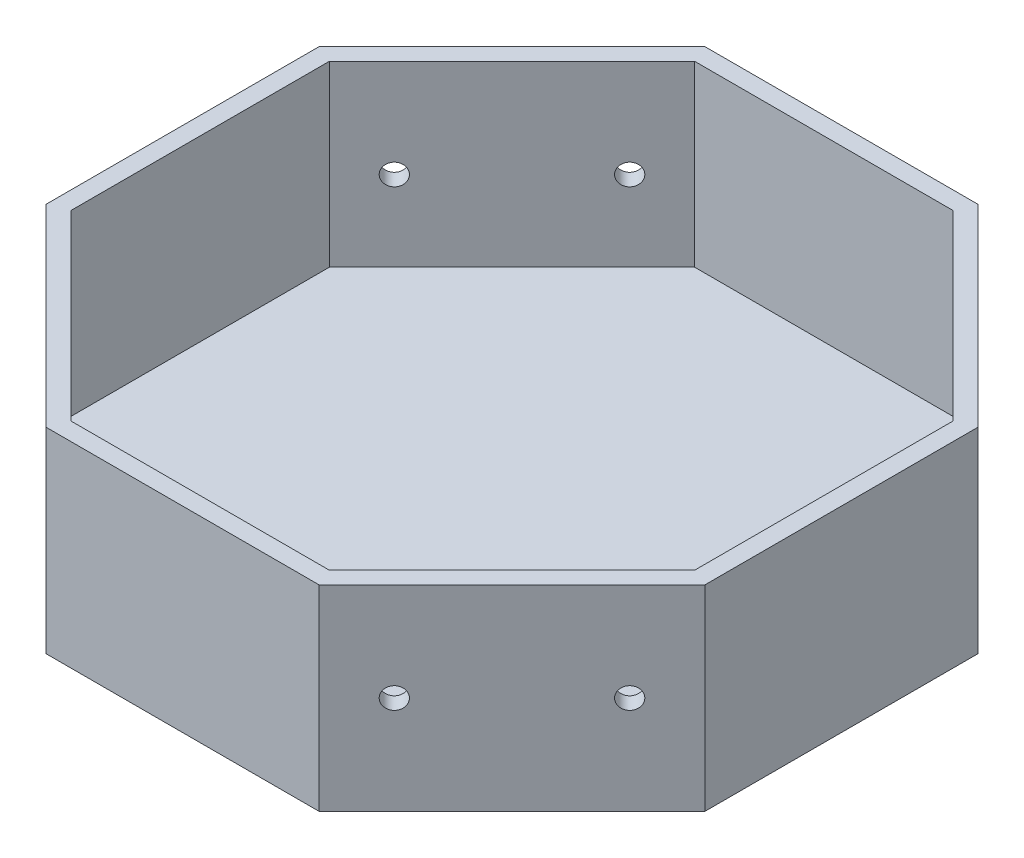
ISO-10303-21;
HEADER;
FILE_DESCRIPTION(('STEP AP214'),'2;1');
FILE_NAME('part.step','',(''),(''),'','','');
FILE_SCHEMA(('AUTOMOTIVE_DESIGN { 1 0 10303 214 1 1 1 1 }'));
ENDSEC;
DATA;
#1=APPLICATION_CONTEXT('core data for automotive mechanical design processes');
#2=APPLICATION_PROTOCOL_DEFINITION('international standard','automotive_design',2000,#1);
#3=PRODUCT_CONTEXT('',#1,'mechanical');
#4=PRODUCT('Part','Part','',(#3));
#5=PRODUCT_RELATED_PRODUCT_CATEGORY('part','',(#4));
#6=PRODUCT_DEFINITION_FORMATION('','',#4);
#7=PRODUCT_DEFINITION_CONTEXT('part definition',#1,'design');
#8=PRODUCT_DEFINITION('design','',#6,#7);
#9=PRODUCT_DEFINITION_SHAPE('','',#8);
#10=(LENGTH_UNIT() NAMED_UNIT(*) SI_UNIT(.MILLI.,.METRE.));
#11=(NAMED_UNIT(*) PLANE_ANGLE_UNIT() SI_UNIT($,.RADIAN.));
#12=(NAMED_UNIT(*) SI_UNIT($,.STERADIAN.) SOLID_ANGLE_UNIT());
#13=UNCERTAINTY_MEASURE_WITH_UNIT(LENGTH_MEASURE(1.E-05),#10,'distance_accuracy_value','');
#14=(GEOMETRIC_REPRESENTATION_CONTEXT(3) GLOBAL_UNCERTAINTY_ASSIGNED_CONTEXT((#13)) GLOBAL_UNIT_ASSIGNED_CONTEXT((#10,
#11,#12)) REPRESENTATION_CONTEXT('',''));
#15=CARTESIAN_POINT('',(0.,0.,0.));
#16=DIRECTION('',(0.,0.,1.));
#17=DIRECTION('',(1.,0.,0.));
#18=AXIS2_PLACEMENT_3D('',#15,#16,#17);
#19=CARTESIAN_POINT('',(55.4327719506772,3.,22.9610059419054));
#20=DIRECTION('',(-1.,0.,0.));
#21=DIRECTION('',(0.,0.,1.));
#22=AXIS2_PLACEMENT_3D('',#19,#20,#21);
#23=PLANE('',#22);
#24=DIRECTION('',(0.,0.,-1.));
#25=VECTOR('',#24,1.);
#26=CARTESIAN_POINT('',(55.4327719506772,0.,22.9610059419054));
#27=LINE('',#26,#25);
#28=CARTESIAN_POINT('',(55.4327719506772,0.,22.9610059419054));
#29=VERTEX_POINT('',#28);
#30=CARTESIAN_POINT('',(55.4327719506772,0.,-22.9610059419054));
#31=VERTEX_POINT('',#30);
#32=EDGE_CURVE('E245',#29,#31,#27,.T.);
#33=ORIENTED_EDGE('',*,*,#32,.T.);
#34=DIRECTION('',(0.,-1.,0.));
#35=VECTOR('',#34,1.);
#36=CARTESIAN_POINT('',(55.4327719506772,3.,-22.9610059419054));
#37=LINE('',#36,#35);
#38=CARTESIAN_POINT('',(55.4327719506772,33.,-22.9610059419054));
#39=VERTEX_POINT('',#38);
#40=EDGE_CURVE('E11',#39,#31,#37,.T.);
#41=ORIENTED_EDGE('',*,*,#40,.F.);
#42=DIRECTION('',(0.,0.,-1.));
#43=VECTOR('',#42,1.);
#44=CARTESIAN_POINT('',(55.4327719506772,33.,22.9610059419054));
#45=LINE('',#44,#43);
#46=CARTESIAN_POINT('',(55.4327719506772,33.,22.9610059419054));
#47=VERTEX_POINT('',#46);
#48=EDGE_CURVE('E224',#47,#39,#45,.T.);
#49=ORIENTED_EDGE('',*,*,#48,.F.);
#50=DIRECTION('',(0.,-1.,0.));
#51=VECTOR('',#50,1.);
#52=CARTESIAN_POINT('',(55.4327719506772,3.,22.9610059419054));
#53=LINE('',#52,#51);
#54=EDGE_CURVE('E262',#47,#29,#53,.T.);
#55=ORIENTED_EDGE('',*,*,#54,.T.);
#56=EDGE_LOOP('',(#33,#41,#49,#55));
#57=FACE_BOUND('',#56,.T.);
#58=ADVANCED_FACE('F43',(#57),#23,.F.);
#59=CARTESIAN_POINT('',(55.4327719506772,3.,-22.9610059419054));
#60=DIRECTION('',(-0.707106781186547,0.,0.707106781186547));
#61=DIRECTION('',(0.707106781186548,0.,0.707106781186548));
#62=AXIS2_PLACEMENT_3D('',#59,#60,#61);
#63=PLANE('',#62);
#64=CARTESIAN_POINT('',(49.0963838829029,16.5,-29.2973940096798));
#65=DIRECTION('',(0.707106781186545,0.,-0.70710678118655));
#66=DIRECTION('',(-0.70710678118655,0.,-0.707106781186545));
#67=AXIS2_PLACEMENT_3D('',#64,#65,#66);
#68=CIRCLE('',#67,1.8);
#69=CARTESIAN_POINT('',(47.8235916767671,16.5,-30.5701862158156));
#70=VERTEX_POINT('',#69);
#71=EDGE_CURVE('E410',#70,#70,#68,.T.);
#72=ORIENTED_EDGE('',*,*,#71,.F.);
#73=EDGE_LOOP('',(#72));
#74=FACE_BOUND('',#73,.T.);
#75=CARTESIAN_POINT('',(29.2973940096795,16.5,-49.0963838829031));
#76=DIRECTION('',(0.707106781186545,0.,-0.70710678118655));
#77=DIRECTION('',(-0.70710678118655,0.,-0.707106781186545));
#78=AXIS2_PLACEMENT_3D('',#75,#76,#77);
#79=CIRCLE('',#78,1.8);
#80=CARTESIAN_POINT('',(28.0246018035437,16.5,-50.3691760890389));
#81=VERTEX_POINT('',#80);
#82=EDGE_CURVE('E416',#81,#81,#79,.T.);
#83=ORIENTED_EDGE('',*,*,#82,.F.);
#84=EDGE_LOOP('',(#83));
#85=FACE_BOUND('',#84,.T.);
#86=DIRECTION('',(-0.707106781186548,0.,-0.707106781186548));
#87=VECTOR('',#86,1.);
#88=CARTESIAN_POINT('',(55.4327719506772,0.,-22.9610059419054));
#89=LINE('',#88,#87);
#90=CARTESIAN_POINT('',(22.9610059419054,0.,-55.4327719506772));
#91=VERTEX_POINT('',#90);
#92=EDGE_CURVE('E248',#31,#91,#89,.T.);
#93=ORIENTED_EDGE('',*,*,#92,.T.);
#94=DIRECTION('',(0.,-1.,0.));
#95=VECTOR('',#94,1.);
#96=CARTESIAN_POINT('',(22.9610059419054,3.,-55.4327719506772));
#97=LINE('',#96,#95);
#98=CARTESIAN_POINT('',(22.9610059419054,33.,-55.4327719506772));
#99=VERTEX_POINT('',#98);
#100=EDGE_CURVE('E50',#99,#91,#97,.T.);
#101=ORIENTED_EDGE('',*,*,#100,.F.);
#102=DIRECTION('',(-0.707106781186548,0.,-0.707106781186548));
#103=VECTOR('',#102,1.);
#104=CARTESIAN_POINT('',(55.4327719506772,33.,-22.9610059419054));
#105=LINE('',#104,#103);
#106=EDGE_CURVE('E227',#39,#99,#105,.T.);
#107=ORIENTED_EDGE('',*,*,#106,.F.);
#108=ORIENTED_EDGE('',*,*,#40,.T.);
#109=EDGE_LOOP('',(#93,#101,#107,#108));
#110=FACE_BOUND('',#109,.T.);
#111=ADVANCED_FACE('F312',(#74,#85,#110),#63,.F.);
#112=CARTESIAN_POINT('',(22.9610059419054,3.,-55.4327719506772));
#113=DIRECTION('',(0.,0.,1.));
#114=DIRECTION('',(1.,0.,0.));
#115=AXIS2_PLACEMENT_3D('',#112,#113,#114);
#116=PLANE('',#115);
#117=DIRECTION('',(-1.,0.,0.));
#118=VECTOR('',#117,1.);
#119=CARTESIAN_POINT('',(22.9610059419054,0.,-55.4327719506772));
#120=LINE('',#119,#118);
#121=CARTESIAN_POINT('',(-22.9610059419054,0.,-55.4327719506772));
#122=VERTEX_POINT('',#121);
#123=EDGE_CURVE('E250',#91,#122,#120,.T.);
#124=ORIENTED_EDGE('',*,*,#123,.T.);
#125=DIRECTION('',(0.,-1.,0.));
#126=VECTOR('',#125,1.);
#127=CARTESIAN_POINT('',(-22.9610059419054,3.,-55.4327719506772));
#128=LINE('',#127,#126);
#129=CARTESIAN_POINT('',(-22.9610059419054,33.,-55.4327719506772));
#130=VERTEX_POINT('',#129);
#131=EDGE_CURVE('E277',#130,#122,#128,.T.);
#132=ORIENTED_EDGE('',*,*,#131,.F.);
#133=DIRECTION('',(-1.,0.,0.));
#134=VECTOR('',#133,1.);
#135=CARTESIAN_POINT('',(22.9610059419054,33.,-55.4327719506772));
#136=LINE('',#135,#134);
#137=EDGE_CURVE('E230',#99,#130,#136,.T.);
#138=ORIENTED_EDGE('',*,*,#137,.F.);
#139=ORIENTED_EDGE('',*,*,#100,.T.);
#140=EDGE_LOOP('',(#124,#132,#138,#139));
#141=FACE_BOUND('',#140,.T.);
#142=ADVANCED_FACE('F283',(#141),#116,.F.);
#143=CARTESIAN_POINT('',(-22.9610059419054,3.,-55.4327719506772));
#144=DIRECTION('',(0.707106781186548,0.,0.707106781186547));
#145=DIRECTION('',(0.707106781186547,0.,-0.707106781186548));
#146=AXIS2_PLACEMENT_3D('',#143,#144,#145);
#147=PLANE('',#146);
#148=CARTESIAN_POINT('',(-29.2973940096796,16.5,-49.096383882903));
#149=DIRECTION('',(-0.707106781186548,0.,-0.707106781186547));
#150=DIRECTION('',(-0.707106781186547,0.,0.707106781186548));
#151=AXIS2_PLACEMENT_3D('',#148,#149,#150);
#152=CIRCLE('',#151,1.8);
#153=CARTESIAN_POINT('',(-30.5701862158154,16.5,-47.8235916767672));
#154=VERTEX_POINT('',#153);
#155=EDGE_CURVE('E422',#154,#154,#152,.T.);
#156=ORIENTED_EDGE('',*,*,#155,.F.);
#157=EDGE_LOOP('',(#156));
#158=FACE_BOUND('',#157,.T.);
#159=CARTESIAN_POINT('',(-49.096383882903,16.5,-29.2973940096796));
#160=DIRECTION('',(-0.707106781186548,0.,-0.707106781186547));
#161=DIRECTION('',(-0.707106781186547,0.,0.707106781186548));
#162=AXIS2_PLACEMENT_3D('',#159,#160,#161);
#163=CIRCLE('',#162,1.8);
#164=CARTESIAN_POINT('',(-50.3691760890388,16.5,-28.0246018035438));
#165=VERTEX_POINT('',#164);
#166=EDGE_CURVE('E430',#165,#165,#163,.T.);
#167=ORIENTED_EDGE('',*,*,#166,.F.);
#168=EDGE_LOOP('',(#167));
#169=FACE_BOUND('',#168,.T.);
#170=DIRECTION('',(-0.707106781186547,0.,0.707106781186548));
#171=VECTOR('',#170,1.);
#172=CARTESIAN_POINT('',(-22.9610059419054,0.,-55.4327719506772));
#173=LINE('',#172,#171);
#174=CARTESIAN_POINT('',(-55.4327719506772,0.,-22.9610059419054));
#175=VERTEX_POINT('',#174);
#176=EDGE_CURVE('E252',#122,#175,#173,.T.);
#177=ORIENTED_EDGE('',*,*,#176,.T.);
#178=DIRECTION('',(0.,-1.,0.));
#179=VECTOR('',#178,1.);
#180=CARTESIAN_POINT('',(-55.4327719506772,3.,-22.9610059419054));
#181=LINE('',#180,#179);
#182=CARTESIAN_POINT('',(-55.4327719506772,33.,-22.9610059419054));
#183=VERTEX_POINT('',#182);
#184=EDGE_CURVE('E274',#183,#175,#181,.T.);
#185=ORIENTED_EDGE('',*,*,#184,.F.);
#186=DIRECTION('',(-0.707106781186547,0.,0.707106781186548));
#187=VECTOR('',#186,1.);
#188=CARTESIAN_POINT('',(-22.9610059419054,33.,-55.4327719506772));
#189=LINE('',#188,#187);
#190=EDGE_CURVE('E233',#130,#183,#189,.T.);
#191=ORIENTED_EDGE('',*,*,#190,.F.);
#192=ORIENTED_EDGE('',*,*,#131,.T.);
#193=EDGE_LOOP('',(#177,#185,#191,#192));
#194=FACE_BOUND('',#193,.T.);
#195=ADVANCED_FACE('F293',(#158,#169,#194),#147,.F.);
#196=CARTESIAN_POINT('',(-55.4327719506772,3.,-22.9610059419054));
#197=DIRECTION('',(1.,0.,0.));
#198=DIRECTION('',(0.,0.,-1.));
#199=AXIS2_PLACEMENT_3D('',#196,#197,#198);
#200=PLANE('',#199);
#201=DIRECTION('',(0.,0.,1.));
#202=VECTOR('',#201,1.);
#203=CARTESIAN_POINT('',(-55.4327719506772,0.,-22.9610059419054));
#204=LINE('',#203,#202);
#205=CARTESIAN_POINT('',(-55.4327719506772,0.,22.9610059419054));
#206=VERTEX_POINT('',#205);
#207=EDGE_CURVE('E254',#175,#206,#204,.T.);
#208=ORIENTED_EDGE('',*,*,#207,.T.);
#209=DIRECTION('',(0.,-1.,0.));
#210=VECTOR('',#209,1.);
#211=CARTESIAN_POINT('',(-55.4327719506772,3.,22.9610059419054));
#212=LINE('',#211,#210);
#213=CARTESIAN_POINT('',(-55.4327719506772,33.,22.9610059419054));
#214=VERTEX_POINT('',#213);
#215=EDGE_CURVE('E271',#214,#206,#212,.T.);
#216=ORIENTED_EDGE('',*,*,#215,.F.);
#217=DIRECTION('',(0.,0.,1.));
#218=VECTOR('',#217,1.);
#219=CARTESIAN_POINT('',(-55.4327719506772,33.,-22.9610059419054));
#220=LINE('',#219,#218);
#221=EDGE_CURVE('E236',#183,#214,#220,.T.);
#222=ORIENTED_EDGE('',*,*,#221,.F.);
#223=ORIENTED_EDGE('',*,*,#184,.T.);
#224=EDGE_LOOP('',(#208,#216,#222,#223));
#225=FACE_BOUND('',#224,.T.);
#226=ADVANCED_FACE('F297',(#225),#200,.F.);
#227=CARTESIAN_POINT('',(-55.4327719506772,3.,22.9610059419054));
#228=DIRECTION('',(0.707106781186547,0.,-0.707106781186548));
#229=DIRECTION('',(-0.707106781186548,0.,-0.707106781186547));
#230=AXIS2_PLACEMENT_3D('',#227,#228,#229);
#231=PLANE('',#230);
#232=CARTESIAN_POINT('',(-49.0963838829027,16.5,29.2973940096802));
#233=DIRECTION('',(-0.70710678118654,0.,0.707106781186555));
#234=DIRECTION('',(0.707106781186555,0.,0.70710678118654));
#235=AXIS2_PLACEMENT_3D('',#232,#233,#234);
#236=CIRCLE('',#235,1.8);
#237=CARTESIAN_POINT('',(-47.8235916767669,16.5,30.5701862158159));
#238=VERTEX_POINT('',#237);
#239=EDGE_CURVE('E436',#238,#238,#236,.T.);
#240=ORIENTED_EDGE('',*,*,#239,.F.);
#241=EDGE_LOOP('',(#240));
#242=FACE_BOUND('',#241,.T.);
#243=CARTESIAN_POINT('',(-29.2973940096791,16.5,49.0963838829033));
#244=DIRECTION('',(-0.70710678118654,0.,0.707106781186555));
#245=DIRECTION('',(0.707106781186555,0.,0.70710678118654));
#246=AXIS2_PLACEMENT_3D('',#243,#244,#245);
#247=CIRCLE('',#246,1.8);
#248=CARTESIAN_POINT('',(-28.0246018035433,16.5,50.3691760890391));
#249=VERTEX_POINT('',#248);
#250=EDGE_CURVE('E442',#249,#249,#247,.T.);
#251=ORIENTED_EDGE('',*,*,#250,.F.);
#252=EDGE_LOOP('',(#251));
#253=FACE_BOUND('',#252,.T.);
#254=DIRECTION('',(0.707106781186548,0.,0.707106781186547));
#255=VECTOR('',#254,1.);
#256=CARTESIAN_POINT('',(-55.4327719506772,0.,22.9610059419054));
#257=LINE('',#256,#255);
#258=CARTESIAN_POINT('',(-22.9610059419053,0.,55.4327719506772));
#259=VERTEX_POINT('',#258);
#260=EDGE_CURVE('E256',#206,#259,#257,.T.);
#261=ORIENTED_EDGE('',*,*,#260,.T.);
#262=DIRECTION('',(0.,-1.,0.));
#263=VECTOR('',#262,1.);
#264=CARTESIAN_POINT('',(-22.9610059419053,3.,55.4327719506772));
#265=LINE('',#264,#263);
#266=CARTESIAN_POINT('',(-22.9610059419053,33.,55.4327719506772));
#267=VERTEX_POINT('',#266);
#268=EDGE_CURVE('E268',#267,#259,#265,.T.);
#269=ORIENTED_EDGE('',*,*,#268,.F.);
#270=DIRECTION('',(0.707106781186548,0.,0.707106781186547));
#271=VECTOR('',#270,1.);
#272=CARTESIAN_POINT('',(-55.4327719506772,33.,22.9610059419054));
#273=LINE('',#272,#271);
#274=EDGE_CURVE('E239',#214,#267,#273,.T.);
#275=ORIENTED_EDGE('',*,*,#274,.F.);
#276=ORIENTED_EDGE('',*,*,#215,.T.);
#277=EDGE_LOOP('',(#261,#269,#275,#276));
#278=FACE_BOUND('',#277,.T.);
#279=ADVANCED_FACE('F302',(#242,#253,#278),#231,.F.);
#280=CARTESIAN_POINT('',(-22.9610059419053,3.,55.4327719506772));
#281=DIRECTION('',(0.,0.,-1.));
#282=DIRECTION('',(-1.,0.,0.));
#283=AXIS2_PLACEMENT_3D('',#280,#281,#282);
#284=PLANE('',#283);
#285=DIRECTION('',(1.,0.,0.));
#286=VECTOR('',#285,1.);
#287=CARTESIAN_POINT('',(-22.9610059419053,0.,55.4327719506772));
#288=LINE('',#287,#286);
#289=CARTESIAN_POINT('',(22.9610059419054,0.,55.4327719506772));
#290=VERTEX_POINT('',#289);
#291=EDGE_CURVE('E258',#259,#290,#288,.T.);
#292=ORIENTED_EDGE('',*,*,#291,.T.);
#293=DIRECTION('',(0.,-1.,0.));
#294=VECTOR('',#293,1.);
#295=CARTESIAN_POINT('',(22.9610059419054,3.,55.4327719506772));
#296=LINE('',#295,#294);
#297=CARTESIAN_POINT('',(22.9610059419054,33.,55.4327719506772));
#298=VERTEX_POINT('',#297);
#299=EDGE_CURVE('E265',#298,#290,#296,.T.);
#300=ORIENTED_EDGE('',*,*,#299,.F.);
#301=DIRECTION('',(1.,0.,0.));
#302=VECTOR('',#301,1.);
#303=CARTESIAN_POINT('',(-22.9610059419053,33.,55.4327719506772));
#304=LINE('',#303,#302);
#305=EDGE_CURVE('E242',#267,#298,#304,.T.);
#306=ORIENTED_EDGE('',*,*,#305,.F.);
#307=ORIENTED_EDGE('',*,*,#268,.T.);
#308=EDGE_LOOP('',(#292,#300,#306,#307));
#309=FACE_BOUND('',#308,.T.);
#310=ADVANCED_FACE('F305',(#309),#284,.F.);
#311=CARTESIAN_POINT('',(22.9610059419054,3.,55.4327719506772));
#312=DIRECTION('',(-0.707106781186548,0.,-0.707106781186547));
#313=DIRECTION('',(-0.707106781186547,0.,0.707106781186548));
#314=AXIS2_PLACEMENT_3D('',#311,#312,#313);
#315=PLANE('',#314);
#316=CARTESIAN_POINT('',(29.2973940096796,16.5,49.096383882903));
#317=DIRECTION('',(0.707106781186548,0.,0.707106781186547));
#318=DIRECTION('',(0.707106781186547,0.,-0.707106781186548));
#319=AXIS2_PLACEMENT_3D('',#316,#317,#318);
#320=CIRCLE('',#319,1.8);
#321=CARTESIAN_POINT('',(30.5701862158154,16.5,47.8235916767672));
#322=VERTEX_POINT('',#321);
#323=EDGE_CURVE('E192',#322,#322,#320,.T.);
#324=ORIENTED_EDGE('',*,*,#323,.F.);
#325=EDGE_LOOP('',(#324));
#326=FACE_BOUND('',#325,.T.);
#327=CARTESIAN_POINT('',(49.096383882903,16.5,29.2973940096796));
#328=DIRECTION('',(0.707106781186548,0.,0.707106781186547));
#329=DIRECTION('',(0.707106781186547,0.,-0.707106781186548));
#330=AXIS2_PLACEMENT_3D('',#327,#328,#329);
#331=CIRCLE('',#330,1.8);
#332=CARTESIAN_POINT('',(50.3691760890388,16.5,28.0246018035438));
#333=VERTEX_POINT('',#332);
#334=EDGE_CURVE('E411',#333,#333,#331,.T.);
#335=ORIENTED_EDGE('',*,*,#334,.F.);
#336=EDGE_LOOP('',(#335));
#337=FACE_BOUND('',#336,.T.);
#338=DIRECTION('',(0.707106781186547,0.,-0.707106781186548));
#339=VECTOR('',#338,1.);
#340=CARTESIAN_POINT('',(22.9610059419054,0.,55.4327719506772));
#341=LINE('',#340,#339);
#342=EDGE_CURVE('E260',#290,#29,#341,.T.);
#343=ORIENTED_EDGE('',*,*,#342,.T.);
#344=ORIENTED_EDGE('',*,*,#54,.F.);
#345=DIRECTION('',(0.707106781186547,0.,-0.707106781186548));
#346=VECTOR('',#345,1.);
#347=CARTESIAN_POINT('',(22.9610059419054,33.,55.4327719506772));
#348=LINE('',#347,#346);
#349=EDGE_CURVE('E169',#298,#47,#348,.T.);
#350=ORIENTED_EDGE('',*,*,#349,.F.);
#351=ORIENTED_EDGE('',*,*,#299,.T.);
#352=EDGE_LOOP('',(#343,#344,#350,#351));
#353=FACE_BOUND('',#352,.T.);
#354=ADVANCED_FACE('F308',(#326,#337,#353),#315,.F.);
#355=CARTESIAN_POINT('',(0.,0.,0.));
#356=DIRECTION('',(0.,1.,0.));
#357=DIRECTION('',(0.,0.,1.));
#358=AXIS2_PLACEMENT_3D('',#355,#356,#357);
#359=PLANE('',#358);
#360=ORIENTED_EDGE('',*,*,#32,.F.);
#361=ORIENTED_EDGE('',*,*,#342,.F.);
#362=ORIENTED_EDGE('',*,*,#291,.F.);
#363=ORIENTED_EDGE('',*,*,#260,.F.);
#364=ORIENTED_EDGE('',*,*,#207,.F.);
#365=ORIENTED_EDGE('',*,*,#176,.F.);
#366=ORIENTED_EDGE('',*,*,#123,.F.);
#367=ORIENTED_EDGE('',*,*,#92,.F.);
#368=EDGE_LOOP('',(#360,#361,#362,#363,#364,#365,#366,#367));
#369=FACE_BOUND('',#368,.T.);
#370=ADVANCED_FACE('F289',(#369),#359,.F.);
#371=CARTESIAN_POINT('',(0.,33.,0.));
#372=DIRECTION('',(0.,1.,0.));
#373=DIRECTION('',(0.,0.,1.));
#374=AXIS2_PLACEMENT_3D('',#371,#372,#373);
#375=PLANE('',#374);
#376=ORIENTED_EDGE('',*,*,#349,.T.);
#377=ORIENTED_EDGE('',*,*,#48,.T.);
#378=ORIENTED_EDGE('',*,*,#106,.T.);
#379=ORIENTED_EDGE('',*,*,#137,.T.);
#380=ORIENTED_EDGE('',*,*,#190,.T.);
#381=ORIENTED_EDGE('',*,*,#221,.T.);
#382=ORIENTED_EDGE('',*,*,#274,.T.);
#383=ORIENTED_EDGE('',*,*,#305,.T.);
#384=EDGE_LOOP('',(#376,#377,#378,#379,#380,#381,#382,#383));
#385=FACE_BOUND('',#384,.T.);
#386=DIRECTION('',(0.,0.,-1.));
#387=VECTOR('',#386,1.);
#388=CARTESIAN_POINT('',(52.4327719506772,33.,21.7183652547861));
#389=LINE('',#388,#387);
#390=CARTESIAN_POINT('',(52.4327719506772,33.,21.7183652547861));
#391=VERTEX_POINT('',#390);
#392=CARTESIAN_POINT('',(52.4327719506772,33.,-21.7183652547861));
#393=VERTEX_POINT('',#392);
#394=EDGE_CURVE('E163',#391,#393,#389,.T.);
#395=ORIENTED_EDGE('',*,*,#394,.F.);
#396=DIRECTION('',(0.707106781186547,0.,-0.707106781186548));
#397=VECTOR('',#396,1.);
#398=CARTESIAN_POINT('',(21.7183652547861,33.,52.4327719506772));
#399=LINE('',#398,#397);
#400=CARTESIAN_POINT('',(21.7183652547861,33.,52.4327719506772));
#401=VERTEX_POINT('',#400);
#402=EDGE_CURVE('E154',#401,#391,#399,.T.);
#403=ORIENTED_EDGE('',*,*,#402,.F.);
#404=DIRECTION('',(1.,0.,0.));
#405=VECTOR('',#404,1.);
#406=CARTESIAN_POINT('',(-21.7183652547861,33.,52.4327719506772));
#407=LINE('',#406,#405);
#408=CARTESIAN_POINT('',(-21.7183652547861,33.,52.4327719506772));
#409=VERTEX_POINT('',#408);
#410=EDGE_CURVE('E189',#409,#401,#407,.T.);
#411=ORIENTED_EDGE('',*,*,#410,.F.);
#412=DIRECTION('',(0.707106781186548,0.,0.707106781186547));
#413=VECTOR('',#412,1.);
#414=CARTESIAN_POINT('',(-52.4327719506772,33.,21.7183652547861));
#415=LINE('',#414,#413);
#416=CARTESIAN_POINT('',(-52.4327719506772,33.,21.7183652547861));
#417=VERTEX_POINT('',#416);
#418=EDGE_CURVE('E186',#417,#409,#415,.T.);
#419=ORIENTED_EDGE('',*,*,#418,.F.);
#420=DIRECTION('',(0.,0.,1.));
#421=VECTOR('',#420,1.);
#422=CARTESIAN_POINT('',(-52.4327719506772,33.,-21.7183652547861));
#423=LINE('',#422,#421);
#424=CARTESIAN_POINT('',(-52.4327719506772,33.,-21.7183652547861));
#425=VERTEX_POINT('',#424);
#426=EDGE_CURVE('E184',#425,#417,#423,.T.);
#427=ORIENTED_EDGE('',*,*,#426,.F.);
#428=DIRECTION('',(-0.707106781186547,0.,0.707106781186548));
#429=VECTOR('',#428,1.);
#430=CARTESIAN_POINT('',(-21.7183652547861,33.,-52.4327719506772));
#431=LINE('',#430,#429);
#432=CARTESIAN_POINT('',(-21.7183652547861,33.,-52.4327719506772));
#433=VERTEX_POINT('',#432);
#434=EDGE_CURVE('E182',#433,#425,#431,.T.);
#435=ORIENTED_EDGE('',*,*,#434,.F.);
#436=DIRECTION('',(-1.,0.,0.));
#437=VECTOR('',#436,1.);
#438=CARTESIAN_POINT('',(21.7183652547861,33.,-52.4327719506772));
#439=LINE('',#438,#437);
#440=CARTESIAN_POINT('',(21.7183652547861,33.,-52.4327719506772));
#441=VERTEX_POINT('',#440);
#442=EDGE_CURVE('E177',#441,#433,#439,.T.);
#443=ORIENTED_EDGE('',*,*,#442,.F.);
#444=DIRECTION('',(-0.707106781186548,0.,-0.707106781186548));
#445=VECTOR('',#444,1.);
#446=CARTESIAN_POINT('',(52.4327719506772,33.,-21.7183652547861));
#447=LINE('',#446,#445);
#448=EDGE_CURVE('E175',#393,#441,#447,.T.);
#449=ORIENTED_EDGE('',*,*,#448,.F.);
#450=EDGE_LOOP('',(#395,#403,#411,#419,#427,#435,#443,#449));
#451=FACE_BOUND('',#450,.T.);
#452=ADVANCED_FACE('F173',(#385,#451),#375,.T.);
#453=CARTESIAN_POINT('',(21.7183652547861,33.,52.4327719506772));
#454=DIRECTION('',(-0.707106781186548,0.,-0.707106781186547));
#455=DIRECTION('',(-0.707106781186547,0.,0.707106781186548));
#456=AXIS2_PLACEMENT_3D('',#453,#454,#455);
#457=PLANE('',#456);
#458=CARTESIAN_POINT('',(27.17607366612,16.5,46.9750635393433));
#459=DIRECTION('',(-0.707106781186548,0.,-0.707106781186547));
#460=DIRECTION('',(-0.707106781186547,0.,0.707106781186548));
#461=AXIS2_PLACEMENT_3D('',#458,#459,#460);
#462=CIRCLE('',#461,1.8);
#463=CARTESIAN_POINT('',(25.9032814599842,16.5,48.2478557454791));
#464=VERTEX_POINT('',#463);
#465=EDGE_CURVE('E448',#464,#464,#462,.F.);
#466=ORIENTED_EDGE('',*,*,#465,.T.);
#467=EDGE_LOOP('',(#466));
#468=FACE_BOUND('',#467,.T.);
#469=CARTESIAN_POINT('',(46.9750635393433,16.5,27.17607366612));
#470=DIRECTION('',(-0.707106781186548,0.,-0.707106781186547));
#471=DIRECTION('',(-0.707106781186547,0.,0.707106781186548));
#472=AXIS2_PLACEMENT_3D('',#469,#470,#471);
#473=CIRCLE('',#472,1.8);
#474=CARTESIAN_POINT('',(45.7022713332076,16.5,28.4488658722558));
#475=VERTEX_POINT('',#474);
#476=EDGE_CURVE('E414',#475,#475,#473,.F.);
#477=ORIENTED_EDGE('',*,*,#476,.T.);
#478=EDGE_LOOP('',(#477));
#479=FACE_BOUND('',#478,.T.);
#480=DIRECTION('',(0.707106781186547,0.,-0.707106781186548));
#481=VECTOR('',#480,1.);
#482=CARTESIAN_POINT('',(21.7183652547861,3.,52.4327719506772));
#483=LINE('',#482,#481);
#484=CARTESIAN_POINT('',(21.7183652547861,3.,52.4327719506772));
#485=VERTEX_POINT('',#484);
#486=CARTESIAN_POINT('',(52.4327719506772,3.,21.7183652547861));
#487=VERTEX_POINT('',#486);
#488=EDGE_CURVE('E57',#485,#487,#483,.T.);
#489=ORIENTED_EDGE('',*,*,#488,.F.);
#490=DIRECTION('',(0.,-1.,0.));
#491=VECTOR('',#490,1.);
#492=CARTESIAN_POINT('',(21.7183652547861,33.,52.4327719506772));
#493=LINE('',#492,#491);
#494=EDGE_CURVE('E159',#401,#485,#493,.T.);
#495=ORIENTED_EDGE('',*,*,#494,.F.);
#496=ORIENTED_EDGE('',*,*,#402,.T.);
#497=DIRECTION('',(0.,-1.,0.));
#498=VECTOR('',#497,1.);
#499=CARTESIAN_POINT('',(52.4327719506772,33.,21.7183652547861));
#500=LINE('',#499,#498);
#501=EDGE_CURVE('E157',#391,#487,#500,.T.);
#502=ORIENTED_EDGE('',*,*,#501,.T.);
#503=EDGE_LOOP('',(#489,#495,#496,#502));
#504=FACE_BOUND('',#503,.T.);
#505=ADVANCED_FACE('F156',(#468,#479,#504),#457,.T.);
#506=CARTESIAN_POINT('',(52.4327719506772,33.,21.7183652547861));
#507=DIRECTION('',(-1.,0.,0.));
#508=DIRECTION('',(0.,0.,1.));
#509=AXIS2_PLACEMENT_3D('',#506,#507,#508);
#510=PLANE('',#509);
#511=DIRECTION('',(0.,0.,-1.));
#512=VECTOR('',#511,1.);
#513=CARTESIAN_POINT('',(52.4327719506772,3.,21.7183652547861));
#514=LINE('',#513,#512);
#515=CARTESIAN_POINT('',(52.4327719506772,3.,-21.7183652547861));
#516=VERTEX_POINT('',#515);
#517=EDGE_CURVE('E61',#487,#516,#514,.T.);
#518=ORIENTED_EDGE('',*,*,#517,.F.);
#519=ORIENTED_EDGE('',*,*,#501,.F.);
#520=ORIENTED_EDGE('',*,*,#394,.T.);
#521=DIRECTION('',(0.,-1.,0.));
#522=VECTOR('',#521,1.);
#523=CARTESIAN_POINT('',(52.4327719506772,33.,-21.7183652547861));
#524=LINE('',#523,#522);
#525=EDGE_CURVE('E170',#393,#516,#524,.T.);
#526=ORIENTED_EDGE('',*,*,#525,.T.);
#527=EDGE_LOOP('',(#518,#519,#520,#526));
#528=FACE_BOUND('',#527,.T.);
#529=ADVANCED_FACE('F167',(#528),#510,.T.);
#530=CARTESIAN_POINT('',(52.4327719506772,33.,-21.7183652547861));
#531=DIRECTION('',(-0.707106781186547,0.,0.707106781186547));
#532=DIRECTION('',(0.707106781186548,0.,0.707106781186548));
#533=AXIS2_PLACEMENT_3D('',#530,#531,#532);
#534=PLANE('',#533);
#535=CARTESIAN_POINT('',(46.9750635393432,16.5,-27.1760736661201));
#536=DIRECTION('',(-0.707106781186547,0.,0.707106781186547));
#537=DIRECTION('',(0.707106781186548,0.,0.707106781186548));
#538=AXIS2_PLACEMENT_3D('',#535,#536,#537);
#539=CIRCLE('',#538,1.8);
#540=CARTESIAN_POINT('',(48.247855745479,16.5,-25.9032814599843));
#541=VERTEX_POINT('',#540);
#542=EDGE_CURVE('E408',#541,#541,#539,.F.);
#543=ORIENTED_EDGE('',*,*,#542,.T.);
#544=EDGE_LOOP('',(#543));
#545=FACE_BOUND('',#544,.T.);
#546=CARTESIAN_POINT('',(27.1760736661199,16.5,-46.9750635393435));
#547=DIRECTION('',(-0.707106781186547,0.,0.707106781186547));
#548=DIRECTION('',(0.707106781186548,0.,0.707106781186548));
#549=AXIS2_PLACEMENT_3D('',#546,#547,#548);
#550=CIRCLE('',#549,1.8);
#551=CARTESIAN_POINT('',(28.4488658722556,16.5,-45.7022713332077));
#552=VERTEX_POINT('',#551);
#553=EDGE_CURVE('E419',#552,#552,#550,.F.);
#554=ORIENTED_EDGE('',*,*,#553,.T.);
#555=EDGE_LOOP('',(#554));
#556=FACE_BOUND('',#555,.T.);
#557=DIRECTION('',(-0.707106781186548,0.,-0.707106781186548));
#558=VECTOR('',#557,1.);
#559=CARTESIAN_POINT('',(52.4327719506772,3.,-21.7183652547861));
#560=LINE('',#559,#558);
#561=CARTESIAN_POINT('',(21.7183652547861,3.,-52.4327719506772));
#562=VERTEX_POINT('',#561);
#563=EDGE_CURVE('E194',#516,#562,#560,.T.);
#564=ORIENTED_EDGE('',*,*,#563,.F.);
#565=ORIENTED_EDGE('',*,*,#525,.F.);
#566=ORIENTED_EDGE('',*,*,#448,.T.);
#567=DIRECTION('',(0.,-1.,0.));
#568=VECTOR('',#567,1.);
#569=CARTESIAN_POINT('',(21.7183652547861,33.,-52.4327719506772));
#570=LINE('',#569,#568);
#571=EDGE_CURVE('E218',#441,#562,#570,.T.);
#572=ORIENTED_EDGE('',*,*,#571,.T.);
#573=EDGE_LOOP('',(#564,#565,#566,#572));
#574=FACE_BOUND('',#573,.T.);
#575=ADVANCED_FACE('F351',(#545,#556,#574),#534,.T.);
#576=CARTESIAN_POINT('',(21.7183652547861,33.,-52.4327719506772));
#577=DIRECTION('',(0.,0.,1.));
#578=DIRECTION('',(1.,0.,0.));
#579=AXIS2_PLACEMENT_3D('',#576,#577,#578);
#580=PLANE('',#579);
#581=DIRECTION('',(-1.,0.,0.));
#582=VECTOR('',#581,1.);
#583=CARTESIAN_POINT('',(21.7183652547861,3.,-52.4327719506772));
#584=LINE('',#583,#582);
#585=CARTESIAN_POINT('',(-21.7183652547861,3.,-52.4327719506772));
#586=VERTEX_POINT('',#585);
#587=EDGE_CURVE('E196',#562,#586,#584,.T.);
#588=ORIENTED_EDGE('',*,*,#587,.F.);
#589=ORIENTED_EDGE('',*,*,#571,.F.);
#590=ORIENTED_EDGE('',*,*,#442,.T.);
#591=DIRECTION('',(0.,-1.,0.));
#592=VECTOR('',#591,1.);
#593=CARTESIAN_POINT('',(-21.7183652547861,33.,-52.4327719506772));
#594=LINE('',#593,#592);
#595=EDGE_CURVE('E215',#433,#586,#594,.T.);
#596=ORIENTED_EDGE('',*,*,#595,.T.);
#597=EDGE_LOOP('',(#588,#589,#590,#596));
#598=FACE_BOUND('',#597,.T.);
#599=ADVANCED_FACE('F354',(#598),#580,.T.);
#600=CARTESIAN_POINT('',(-21.7183652547861,33.,-52.4327719506772));
#601=DIRECTION('',(0.707106781186548,0.,0.707106781186547));
#602=DIRECTION('',(0.707106781186547,0.,-0.707106781186548));
#603=AXIS2_PLACEMENT_3D('',#600,#601,#602);
#604=PLANE('',#603);
#605=CARTESIAN_POINT('',(-27.17607366612,16.5,-46.9750635393433));
#606=DIRECTION('',(0.707106781186548,0.,0.707106781186547));
#607=DIRECTION('',(0.707106781186547,0.,-0.707106781186548));
#608=AXIS2_PLACEMENT_3D('',#605,#606,#607);
#609=CIRCLE('',#608,1.8);
#610=CARTESIAN_POINT('',(-25.9032814599842,16.5,-48.2478557454791));
#611=VERTEX_POINT('',#610);
#612=EDGE_CURVE('E427',#611,#611,#609,.F.);
#613=ORIENTED_EDGE('',*,*,#612,.T.);
#614=EDGE_LOOP('',(#613));
#615=FACE_BOUND('',#614,.T.);
#616=CARTESIAN_POINT('',(-46.9750635393433,16.5,-27.17607366612));
#617=DIRECTION('',(0.707106781186548,0.,0.707106781186547));
#618=DIRECTION('',(0.707106781186547,0.,-0.707106781186548));
#619=AXIS2_PLACEMENT_3D('',#616,#617,#618);
#620=CIRCLE('',#619,1.8);
#621=CARTESIAN_POINT('',(-45.7022713332075,16.5,-28.4488658722558));
#622=VERTEX_POINT('',#621);
#623=EDGE_CURVE('E433',#622,#622,#620,.F.);
#624=ORIENTED_EDGE('',*,*,#623,.T.);
#625=EDGE_LOOP('',(#624));
#626=FACE_BOUND('',#625,.T.);
#627=DIRECTION('',(-0.707106781186547,0.,0.707106781186548));
#628=VECTOR('',#627,1.);
#629=CARTESIAN_POINT('',(-21.7183652547861,3.,-52.4327719506772));
#630=LINE('',#629,#628);
#631=CARTESIAN_POINT('',(-52.4327719506772,3.,-21.7183652547861));
#632=VERTEX_POINT('',#631);
#633=EDGE_CURVE('E198',#586,#632,#630,.T.);
#634=ORIENTED_EDGE('',*,*,#633,.F.);
#635=ORIENTED_EDGE('',*,*,#595,.F.);
#636=ORIENTED_EDGE('',*,*,#434,.T.);
#637=DIRECTION('',(0.,-1.,0.));
#638=VECTOR('',#637,1.);
#639=CARTESIAN_POINT('',(-52.4327719506772,33.,-21.7183652547861));
#640=LINE('',#639,#638);
#641=EDGE_CURVE('E212',#425,#632,#640,.T.);
#642=ORIENTED_EDGE('',*,*,#641,.T.);
#643=EDGE_LOOP('',(#634,#635,#636,#642));
#644=FACE_BOUND('',#643,.T.);
#645=ADVANCED_FACE('F358',(#615,#626,#644),#604,.T.);
#646=CARTESIAN_POINT('',(-52.4327719506772,33.,-21.7183652547861));
#647=DIRECTION('',(1.,0.,0.));
#648=DIRECTION('',(0.,0.,-1.));
#649=AXIS2_PLACEMENT_3D('',#646,#647,#648);
#650=PLANE('',#649);
#651=DIRECTION('',(0.,0.,1.));
#652=VECTOR('',#651,1.);
#653=CARTESIAN_POINT('',(-52.4327719506772,3.,-21.7183652547861));
#654=LINE('',#653,#652);
#655=CARTESIAN_POINT('',(-52.4327719506772,3.,21.7183652547861));
#656=VERTEX_POINT('',#655);
#657=EDGE_CURVE('E200',#632,#656,#654,.T.);
#658=ORIENTED_EDGE('',*,*,#657,.F.);
#659=ORIENTED_EDGE('',*,*,#641,.F.);
#660=ORIENTED_EDGE('',*,*,#426,.T.);
#661=DIRECTION('',(0.,-1.,0.));
#662=VECTOR('',#661,1.);
#663=CARTESIAN_POINT('',(-52.4327719506772,33.,21.7183652547861));
#664=LINE('',#663,#662);
#665=EDGE_CURVE('E209',#417,#656,#664,.T.);
#666=ORIENTED_EDGE('',*,*,#665,.T.);
#667=EDGE_LOOP('',(#658,#659,#660,#666));
#668=FACE_BOUND('',#667,.T.);
#669=ADVANCED_FACE('F362',(#668),#650,.T.);
#670=CARTESIAN_POINT('',(-52.4327719506772,33.,21.7183652547861));
#671=DIRECTION('',(0.707106781186547,0.,-0.707106781186548));
#672=DIRECTION('',(-0.707106781186548,0.,-0.707106781186547));
#673=AXIS2_PLACEMENT_3D('',#670,#671,#672);
#674=PLANE('',#673);
#675=CARTESIAN_POINT('',(-46.9750635393429,16.5,27.1760736661204));
#676=DIRECTION('',(0.707106781186547,0.,-0.707106781186548));
#677=DIRECTION('',(-0.707106781186548,0.,-0.707106781186547));
#678=AXIS2_PLACEMENT_3D('',#675,#676,#677);
#679=CIRCLE('',#678,1.8);
#680=CARTESIAN_POINT('',(-45.7022713332071,16.5,28.4488658722561));
#681=VERTEX_POINT('',#680);
#682=EDGE_CURVE('E439',#681,#681,#679,.F.);
#683=ORIENTED_EDGE('',*,*,#682,.T.);
#684=EDGE_LOOP('',(#683));
#685=FACE_BOUND('',#684,.T.);
#686=CARTESIAN_POINT('',(-27.1760736661196,16.5,46.9750635393437));
#687=DIRECTION('',(0.707106781186547,0.,-0.707106781186548));
#688=DIRECTION('',(-0.707106781186548,0.,-0.707106781186547));
#689=AXIS2_PLACEMENT_3D('',#686,#687,#688);
#690=CIRCLE('',#689,1.8);
#691=CARTESIAN_POINT('',(-25.9032814599838,16.5,48.2478557454795));
#692=VERTEX_POINT('',#691);
#693=EDGE_CURVE('E445',#692,#692,#690,.F.);
#694=ORIENTED_EDGE('',*,*,#693,.T.);
#695=EDGE_LOOP('',(#694));
#696=FACE_BOUND('',#695,.T.);
#697=DIRECTION('',(0.707106781186548,0.,0.707106781186547));
#698=VECTOR('',#697,1.);
#699=CARTESIAN_POINT('',(-52.4327719506772,3.,21.7183652547861));
#700=LINE('',#699,#698);
#701=CARTESIAN_POINT('',(-21.7183652547861,3.,52.4327719506772));
#702=VERTEX_POINT('',#701);
#703=EDGE_CURVE('E202',#656,#702,#700,.T.);
#704=ORIENTED_EDGE('',*,*,#703,.F.);
#705=ORIENTED_EDGE('',*,*,#665,.F.);
#706=ORIENTED_EDGE('',*,*,#418,.T.);
#707=DIRECTION('',(0.,-1.,0.));
#708=VECTOR('',#707,1.);
#709=CARTESIAN_POINT('',(-21.7183652547861,33.,52.4327719506772));
#710=LINE('',#709,#708);
#711=EDGE_CURVE('E206',#409,#702,#710,.T.);
#712=ORIENTED_EDGE('',*,*,#711,.T.);
#713=EDGE_LOOP('',(#704,#705,#706,#712));
#714=FACE_BOUND('',#713,.T.);
#715=ADVANCED_FACE('F366',(#685,#696,#714),#674,.T.);
#716=CARTESIAN_POINT('',(-21.7183652547861,33.,52.4327719506772));
#717=DIRECTION('',(0.,0.,-1.));
#718=DIRECTION('',(-1.,0.,0.));
#719=AXIS2_PLACEMENT_3D('',#716,#717,#718);
#720=PLANE('',#719);
#721=DIRECTION('',(1.,0.,0.));
#722=VECTOR('',#721,1.);
#723=CARTESIAN_POINT('',(-21.7183652547861,3.,52.4327719506772));
#724=LINE('',#723,#722);
#725=EDGE_CURVE('E164',#702,#485,#724,.T.);
#726=ORIENTED_EDGE('',*,*,#725,.F.);
#727=ORIENTED_EDGE('',*,*,#711,.F.);
#728=ORIENTED_EDGE('',*,*,#410,.T.);
#729=ORIENTED_EDGE('',*,*,#494,.T.);
#730=EDGE_LOOP('',(#726,#727,#728,#729));
#731=FACE_BOUND('',#730,.T.);
#732=ADVANCED_FACE('F343',(#731),#720,.T.);
#733=CARTESIAN_POINT('',(0.,3.,0.));
#734=DIRECTION('',(0.,1.,0.));
#735=DIRECTION('',(0.,0.,1.));
#736=AXIS2_PLACEMENT_3D('',#733,#734,#735);
#737=PLANE('',#736);
#738=ORIENTED_EDGE('',*,*,#488,.T.);
#739=ORIENTED_EDGE('',*,*,#517,.T.);
#740=ORIENTED_EDGE('',*,*,#563,.T.);
#741=ORIENTED_EDGE('',*,*,#587,.T.);
#742=ORIENTED_EDGE('',*,*,#633,.T.);
#743=ORIENTED_EDGE('',*,*,#657,.T.);
#744=ORIENTED_EDGE('',*,*,#703,.T.);
#745=ORIENTED_EDGE('',*,*,#725,.T.);
#746=EDGE_LOOP('',(#738,#739,#740,#741,#742,#743,#744,#745));
#747=FACE_BOUND('',#746,.T.);
#748=ADVANCED_FACE('F339',(#747),#737,.T.);
#749=CARTESIAN_POINT('',(-45.5342770140656,16.5,-65.3332668872889));
#750=DIRECTION('',(0.707106781186548,0.,0.707106781186547));
#751=DIRECTION('',(0.707106781186547,0.,-0.707106781186548));
#752=AXIS2_PLACEMENT_3D('',#749,#750,#751);
#753=CYLINDRICAL_SURFACE('',#752,1.8);
#754=ORIENTED_EDGE('',*,*,#476,.F.);
#755=EDGE_LOOP('',(#754));
#756=FACE_BOUND('',#755,.T.);
#757=ORIENTED_EDGE('',*,*,#334,.T.);
#758=EDGE_LOOP('',(#757));
#759=FACE_BOUND('',#758,.T.);
#760=ADVANCED_FACE('F342',(#756,#759),#753,.F.);
#761=CARTESIAN_POINT('',(-65.3332668872889,16.5,-45.5342770140656));
#762=DIRECTION('',(0.707106781186548,0.,0.707106781186547));
#763=DIRECTION('',(0.707106781186547,0.,-0.707106781186548));
#764=AXIS2_PLACEMENT_3D('',#761,#762,#763);
#765=CYLINDRICAL_SURFACE('',#764,1.8);
#766=ORIENTED_EDGE('',*,*,#465,.F.);
#767=EDGE_LOOP('',(#766));
#768=FACE_BOUND('',#767,.T.);
#769=ORIENTED_EDGE('',*,*,#323,.T.);
#770=EDGE_LOOP('',(#769));
#771=FACE_BOUND('',#770,.T.);
#772=ADVANCED_FACE('F376',(#768,#771),#765,.F.);
#773=CARTESIAN_POINT('',(65.3332668872884,16.5,-45.5342770140663));
#774=DIRECTION('',(-0.70710678118654,0.,0.707106781186555));
#775=DIRECTION('',(0.707106781186555,0.,0.70710678118654));
#776=AXIS2_PLACEMENT_3D('',#773,#774,#775);
#777=CYLINDRICAL_SURFACE('',#776,1.8);
#778=CARTESIAN_POINT('',(-25.9032814599838,16.5,48.2478557454795));
#779=CARTESIAN_POINT('',(-25.9253785468959,16.5,48.2699528323916));
#780=CARTESIAN_POINT('',(-25.9474756338079,16.5,48.2920499193036));
#781=CARTESIAN_POINT('',(-25.9916698076321,16.5,48.3362440931278));
#782=CARTESIAN_POINT('',(-26.0137668945442,16.5,48.3583411800399));
#783=CARTESIAN_POINT('',(-26.0579610683683,16.5,48.402535353864));
#784=CARTESIAN_POINT('',(-26.0800581552804,16.5,48.4246324407761));
#785=CARTESIAN_POINT('',(-26.1242523291046,16.5,48.4688266146003));
#786=CARTESIAN_POINT('',(-26.1463494160166,16.5,48.4909237015123));
#787=CARTESIAN_POINT('',(-26.1905435898408,16.5,48.5351178753365));
#788=CARTESIAN_POINT('',(-26.2126406767529,16.5,48.5572149622486));
#789=CARTESIAN_POINT('',(-26.256834850577,16.5,48.6014091360727));
#790=CARTESIAN_POINT('',(-26.2789319374891,16.5,48.6235062229848));
#791=CARTESIAN_POINT('',(-26.3231261113133,16.5,48.667700396809));
#792=CARTESIAN_POINT('',(-26.3452231982253,16.5,48.6897974837211));
#793=CARTESIAN_POINT('',(-26.3894173720495,16.5,48.7339916575452));
#794=CARTESIAN_POINT('',(-26.4115144589616,16.5,48.7560887444573));
#795=CARTESIAN_POINT('',(-26.4557086327857,16.5,48.8002829182814));
#796=CARTESIAN_POINT('',(-26.4778057196978,16.5,48.8223800051935));
#797=CARTESIAN_POINT('',(-26.521999893522,16.5,48.8665741790177));
#798=CARTESIAN_POINT('',(-26.5440969804341,16.5,48.8886712659298));
#799=CARTESIAN_POINT('',(-26.5882911542582,16.5,48.9328654397539));
#800=CARTESIAN_POINT('',(-26.6103882411703,16.5,48.954962526666));
#801=CARTESIAN_POINT('',(-26.6545824149944,16.5,48.9991567004902));
#802=CARTESIAN_POINT('',(-26.6766795019065,16.5,49.0212537874022));
#803=CARTESIAN_POINT('',(-26.7208736757307,16.5,49.0654479612264));
#804=CARTESIAN_POINT('',(-26.7429707626428,16.5,49.0875450481385));
#805=CARTESIAN_POINT('',(-26.7871649364669,16.5,49.1317392219626));
#806=CARTESIAN_POINT('',(-26.809262023379,16.5,49.1538363088747));
#807=CARTESIAN_POINT('',(-26.8534561972031,16.5,49.1980304826989));
#808=CARTESIAN_POINT('',(-26.8755532841152,16.5,49.2201275696109));
#809=CARTESIAN_POINT('',(-26.9197474579394,16.5,49.2643217434351));
#810=CARTESIAN_POINT('',(-26.9418445448515,16.5,49.2864188303472));
#811=CARTESIAN_POINT('',(-26.9860387186756,16.5,49.3306130041713));
#812=CARTESIAN_POINT('',(-27.0081358055877,16.5,49.3527100910834));
#813=CARTESIAN_POINT('',(-27.0523299794119,16.5,49.3969042649076));
#814=CARTESIAN_POINT('',(-27.0744270663239,16.5,49.4190013518197));
#815=CARTESIAN_POINT('',(-27.1186212401481,16.5,49.4631955256438));
#816=CARTESIAN_POINT('',(-27.1407183270602,16.5,49.4852926125559));
#817=CARTESIAN_POINT('',(-27.1849125008843,16.5,49.52948678638));
#818=CARTESIAN_POINT('',(-27.2070095877964,16.5,49.5515838732921));
#819=CARTESIAN_POINT('',(-27.2512037616206,16.5,49.5957780471163));
#820=CARTESIAN_POINT('',(-27.2733008485326,16.5,49.6178751340284));
#821=CARTESIAN_POINT('',(-27.3174950223568,16.5,49.6620693078525));
#822=CARTESIAN_POINT('',(-27.3395921092689,16.5,49.6841663947646));
#823=CARTESIAN_POINT('',(-27.383786283093,16.5,49.7283605685888));
#824=CARTESIAN_POINT('',(-27.4058833700051,16.5,49.7504576555008));
#825=CARTESIAN_POINT('',(-27.4500775438293,16.5,49.794651829325));
#826=CARTESIAN_POINT('',(-27.4721746307414,16.5,49.8167489162371));
#827=CARTESIAN_POINT('',(-27.5163688045655,16.5,49.8609430900612));
#828=CARTESIAN_POINT('',(-27.5384658914776,16.5,49.8830401769733));
#829=CARTESIAN_POINT('',(-27.5826600653018,16.5,49.9272343507975));
#830=CARTESIAN_POINT('',(-27.6047571522138,16.5,49.9493314377096));
#831=CARTESIAN_POINT('',(-27.648951326038,16.5,49.9935256115337));
#832=CARTESIAN_POINT('',(-27.6710484129501,16.5,50.0156226984458));
#833=CARTESIAN_POINT('',(-27.7152425867742,16.5,50.0598168722699));
#834=CARTESIAN_POINT('',(-27.7373396736863,16.5,50.081913959182));
#835=CARTESIAN_POINT('',(-27.7815338475105,16.5,50.1261081330062));
#836=CARTESIAN_POINT('',(-27.8036309344225,16.5,50.1482052199183));
#837=CARTESIAN_POINT('',(-27.8478251082467,16.5,50.1923993937424));
#838=CARTESIAN_POINT('',(-27.8699221951588,16.5,50.2144964806545));
#839=CARTESIAN_POINT('',(-27.9141163689829,16.5,50.2586906544787));
#840=CARTESIAN_POINT('',(-27.936213455895,16.5,50.2807877413907));
#841=CARTESIAN_POINT('',(-27.9804076297192,16.5,50.3249819152149));
#842=CARTESIAN_POINT('',(-28.0025047166312,16.5,50.347079002127));
#843=CARTESIAN_POINT('',(-28.0246018035433,16.5,50.3691760890391));
#844=B_SPLINE_CURVE_WITH_KNOTS('',3,(#778,#779,#780,#781,#782,#783,#784,#785,#786,#787,#788,
#789,#790,#791,#792,#793,#794,#795,#796,#797,#798,#799,#800,#801,#802,#803,#804,#805,#806,#807,
#808,#809,#810,#811,#812,#813,#814,#815,#816,#817,#818,#819,#820,#821,#822,#823,#824,#825,#826,
#827,#828,#829,#830,#831,#832,#833,#834,#835,#836,#837,#838,#839,#840,#841,#842,#843),
.UNSPECIFIED.,.F.,.F.,(4,2,2,2,2,2,2,2,2,2,2,2,2,2,2,2,2,2,2,2,2,2,2,2,2,2,2,2,2,2,2,2,4),(0.,
0.0937500000000033,0.187500000000007,0.281249999999981,0.374999999999984,0.468749999999987,
0.562499999999961,0.656249999999974,0.749999999999968,0.843749999999981,0.937499999999975,
1.03124999999996,1.12499999999995,1.21874999999997,1.31249999999994,1.40624999999993,
1.49999999999995,1.59374999999994,1.68749999999995,1.78124999999993,1.87499999999993,
1.96874999999993,2.06249999999991,2.15624999999991,2.24999999999992,2.34374999999992,
2.43749999999993,2.5312499999999,2.6249999999999,2.71874999999991,2.81249999999989,
2.90624999999989,2.99999999999989),.UNSPECIFIED.);
#845=EDGE_CURVE('BSEAM379',#692,#249,#844,.T.);
#846=ORIENTED_EDGE('',*,*,#693,.F.);
#847=ORIENTED_EDGE('',*,*,#250,.T.);
#848=ORIENTED_EDGE('',*,*,#845,.T.);
#849=ORIENTED_EDGE('',*,*,#845,.F.);
#850=EDGE_LOOP('',(#846,#848,#847,#849));
#851=FACE_BOUND('',#850,.T.);
#852=ADVANCED_FACE('F379',(#851),#777,.F.);
#853=CARTESIAN_POINT('',(45.5342770140649,16.5,-65.3332668872894));
#854=DIRECTION('',(-0.70710678118654,0.,0.707106781186555));
#855=DIRECTION('',(0.707106781186555,0.,0.70710678118654));
#856=AXIS2_PLACEMENT_3D('',#853,#854,#855);
#857=CYLINDRICAL_SURFACE('',#856,1.8);
#858=CARTESIAN_POINT('',(-45.7022713332071,16.5,28.4488658722561));
#859=CARTESIAN_POINT('',(-45.7243684201192,16.5,28.4709629591682));
#860=CARTESIAN_POINT('',(-45.7464655070313,16.5,28.4930600460803));
#861=CARTESIAN_POINT('',(-45.7906596808554,16.5,28.5372542199045));
#862=CARTESIAN_POINT('',(-45.8127567677675,16.5,28.5593513068166));
#863=CARTESIAN_POINT('',(-45.8569509415917,16.5,28.6035454806407));
#864=CARTESIAN_POINT('',(-45.8790480285038,16.5,28.6256425675528));
#865=CARTESIAN_POINT('',(-45.9232422023279,16.5,28.669836741377));
#866=CARTESIAN_POINT('',(-45.94533928924,16.5,28.691933828289));
#867=CARTESIAN_POINT('',(-45.9895334630642,16.5,28.7361280021132));
#868=CARTESIAN_POINT('',(-46.0116305499762,16.5,28.7582250890253));
#869=CARTESIAN_POINT('',(-46.0558247238004,16.5,28.8024192628494));
#870=CARTESIAN_POINT('',(-46.0779218107125,16.5,28.8245163497615));
#871=CARTESIAN_POINT('',(-46.1221159845366,16.5,28.8687105235857));
#872=CARTESIAN_POINT('',(-46.1442130714487,16.5,28.8908076104978));
#873=CARTESIAN_POINT('',(-46.1884072452729,16.5,28.9350017843219));
#874=CARTESIAN_POINT('',(-46.210504332185,16.5,28.957098871234));
#875=CARTESIAN_POINT('',(-46.2546985060091,16.5,29.0012930450582));
#876=CARTESIAN_POINT('',(-46.2767955929212,16.5,29.0233901319703));
#877=CARTESIAN_POINT('',(-46.3209897667454,16.5,29.0675843057944));
#878=CARTESIAN_POINT('',(-46.3430868536575,16.5,29.0896813927065));
#879=CARTESIAN_POINT('',(-46.3872810274816,16.5,29.1338755665307));
#880=CARTESIAN_POINT('',(-46.4093781143937,16.5,29.1559726534427));
#881=CARTESIAN_POINT('',(-46.4535722882179,16.5,29.2001668272669));
#882=CARTESIAN_POINT('',(-46.4756693751299,16.5,29.222263914179));
#883=CARTESIAN_POINT('',(-46.5198635489541,16.5,29.2664580880032));
#884=CARTESIAN_POINT('',(-46.5419606358662,16.5,29.2885551749152));
#885=CARTESIAN_POINT('',(-46.5861548096903,16.5,29.3327493487394));
#886=CARTESIAN_POINT('',(-46.6082518966024,16.5,29.3548464356515));
#887=CARTESIAN_POINT('',(-46.6524460704266,16.5,29.3990406094756));
#888=CARTESIAN_POINT('',(-46.6745431573387,16.5,29.4211376963877));
#889=CARTESIAN_POINT('',(-46.7187373311628,16.5,29.4653318702119));
#890=CARTESIAN_POINT('',(-46.7408344180749,16.5,29.487428957124));
#891=CARTESIAN_POINT('',(-46.7850285918991,16.5,29.5316231309481));
#892=CARTESIAN_POINT('',(-46.8071256788111,16.5,29.5537202178602));
#893=CARTESIAN_POINT('',(-46.8513198526353,16.5,29.5979143916844));
#894=CARTESIAN_POINT('',(-46.8734169395474,16.5,29.6200114785964));
#895=CARTESIAN_POINT('',(-46.9176111133716,16.5,29.6642056524206));
#896=CARTESIAN_POINT('',(-46.9397082002836,16.5,29.6863027393327));
#897=CARTESIAN_POINT('',(-46.9839023741078,16.5,29.7304969131569));
#898=CARTESIAN_POINT('',(-47.0059994610199,16.5,29.7525940000689));
#899=CARTESIAN_POINT('',(-47.050193634844,16.5,29.7967881738931));
#900=CARTESIAN_POINT('',(-47.0722907217561,16.5,29.8188852608052));
#901=CARTESIAN_POINT('',(-47.1164848955803,16.5,29.8630794346293));
#902=CARTESIAN_POINT('',(-47.1385819824924,16.5,29.8851765215414));
#903=CARTESIAN_POINT('',(-47.1827761563165,16.5,29.9293706953656));
#904=CARTESIAN_POINT('',(-47.2048732432286,16.5,29.9514677822777));
#905=CARTESIAN_POINT('',(-47.2490674170528,16.5,29.9956619561018));
#906=CARTESIAN_POINT('',(-47.2711645039648,16.5,30.0177590430139));
#907=CARTESIAN_POINT('',(-47.315358677789,16.5,30.0619532168381));
#908=CARTESIAN_POINT('',(-47.3374557647011,16.5,30.0840503037502));
#909=CARTESIAN_POINT('',(-47.3816499385252,16.5,30.1282444775743));
#910=CARTESIAN_POINT('',(-47.4037470254373,16.5,30.1503415644864));
#911=CARTESIAN_POINT('',(-47.4479411992615,16.5,30.1945357383106));
#912=CARTESIAN_POINT('',(-47.4700382861736,16.5,30.2166328252226));
#913=CARTESIAN_POINT('',(-47.5142324599977,16.5,30.2608269990468));
#914=CARTESIAN_POINT('',(-47.5363295469098,16.5,30.2829240859589));
#915=CARTESIAN_POINT('',(-47.580523720734,16.5,30.3271182597831));
#916=CARTESIAN_POINT('',(-47.6026208076461,16.5,30.3492153466951));
#917=CARTESIAN_POINT('',(-47.6468149814702,16.5,30.3934095205193));
#918=CARTESIAN_POINT('',(-47.6689120683823,16.5,30.4155066074314));
#919=CARTESIAN_POINT('',(-47.7131062422065,16.5,30.4597007812555));
#920=CARTESIAN_POINT('',(-47.7352033291185,16.5,30.4817978681676));
#921=CARTESIAN_POINT('',(-47.7793975029427,16.5,30.5259920419918));
#922=CARTESIAN_POINT('',(-47.8014945898548,16.5,30.5480891289039));
#923=CARTESIAN_POINT('',(-47.8235916767669,16.5,30.5701862158159));
#924=B_SPLINE_CURVE_WITH_KNOTS('',3,(#858,#859,#860,#861,#862,#863,#864,#865,#866,#867,#868,
#869,#870,#871,#872,#873,#874,#875,#876,#877,#878,#879,#880,#881,#882,#883,#884,#885,#886,#887,
#888,#889,#890,#891,#892,#893,#894,#895,#896,#897,#898,#899,#900,#901,#902,#903,#904,#905,#906,
#907,#908,#909,#910,#911,#912,#913,#914,#915,#916,#917,#918,#919,#920,#921,#922,#923),
.UNSPECIFIED.,.F.,.F.,(4,2,2,2,2,2,2,2,2,2,2,2,2,2,2,2,2,2,2,2,2,2,2,2,2,2,2,2,2,2,2,2,4),(0.,
0.0937500000000132,0.187500000000017,0.28125000000001,0.375000000000023,0.468750000000017,
0.56250000000003,0.656250000000023,0.750000000000037,0.843750000000069,0.937500000000063,
1.03125000000008,1.12500000000008,1.21875000000007,1.31250000000009,1.40625000000008,
1.50000000000009,1.59375000000009,1.6875000000001,1.7812500000001,1.87500000000011,
1.96875000000011,2.06250000000011,2.15625000000012,2.25000000000015,2.34375000000014,
2.43750000000016,2.53125000000015,2.62500000000016,2.71875000000017,2.81250000000017,
2.90625000000017,3.00000000000018),.UNSPECIFIED.);
#925=EDGE_CURVE('BSEAM383',#681,#238,#924,.T.);
#926=ORIENTED_EDGE('',*,*,#682,.F.);
#927=ORIENTED_EDGE('',*,*,#239,.T.);
#928=ORIENTED_EDGE('',*,*,#925,.T.);
#929=ORIENTED_EDGE('',*,*,#925,.F.);
#930=EDGE_LOOP('',(#926,#928,#927,#929));
#931=FACE_BOUND('',#930,.T.);
#932=ADVANCED_FACE('F383',(#931),#857,.F.);
#933=CARTESIAN_POINT('',(45.5342770140656,16.5,65.3332668872889));
#934=DIRECTION('',(-0.707106781186548,0.,-0.707106781186547));
#935=DIRECTION('',(-0.707106781186547,0.,0.707106781186548));
#936=AXIS2_PLACEMENT_3D('',#933,#934,#935);
#937=CYLINDRICAL_SURFACE('',#936,1.8);
#938=ORIENTED_EDGE('',*,*,#623,.F.);
#939=EDGE_LOOP('',(#938));
#940=FACE_BOUND('',#939,.T.);
#941=ORIENTED_EDGE('',*,*,#166,.T.);
#942=EDGE_LOOP('',(#941));
#943=FACE_BOUND('',#942,.T.);
#944=ADVANCED_FACE('F387',(#940,#943),#937,.F.);
#945=CARTESIAN_POINT('',(65.3332668872889,16.5,45.5342770140656));
#946=DIRECTION('',(-0.707106781186548,0.,-0.707106781186547));
#947=DIRECTION('',(-0.707106781186547,0.,0.707106781186548));
#948=AXIS2_PLACEMENT_3D('',#945,#946,#947);
#949=CYLINDRICAL_SURFACE('',#948,1.8);
#950=ORIENTED_EDGE('',*,*,#612,.F.);
#951=EDGE_LOOP('',(#950));
#952=FACE_BOUND('',#951,.T.);
#953=ORIENTED_EDGE('',*,*,#155,.T.);
#954=EDGE_LOOP('',(#953));
#955=FACE_BOUND('',#954,.T.);
#956=ADVANCED_FACE('F391',(#952,#955),#949,.F.);
#957=CARTESIAN_POINT('',(-65.3332668872887,16.5,45.5342770140658));
#958=DIRECTION('',(0.707106781186545,0.,-0.70710678118655));
#959=DIRECTION('',(-0.70710678118655,0.,-0.707106781186545));
#960=AXIS2_PLACEMENT_3D('',#957,#958,#959);
#961=CYLINDRICAL_SURFACE('',#960,1.8);
#962=ORIENTED_EDGE('',*,*,#553,.F.);
#963=EDGE_LOOP('',(#962));
#964=FACE_BOUND('',#963,.T.);
#965=ORIENTED_EDGE('',*,*,#82,.T.);
#966=EDGE_LOOP('',(#965));
#967=FACE_BOUND('',#966,.T.);
#968=ADVANCED_FACE('F395',(#964,#967),#961,.F.);
#969=CARTESIAN_POINT('',(-45.5342770140653,16.5,65.3332668872891));
#970=DIRECTION('',(0.707106781186545,0.,-0.70710678118655));
#971=DIRECTION('',(-0.70710678118655,0.,-0.707106781186545));
#972=AXIS2_PLACEMENT_3D('',#969,#970,#971);
#973=CYLINDRICAL_SURFACE('',#972,1.8);
#974=ORIENTED_EDGE('',*,*,#542,.F.);
#975=EDGE_LOOP('',(#974));
#976=FACE_BOUND('',#975,.T.);
#977=ORIENTED_EDGE('',*,*,#71,.T.);
#978=EDGE_LOOP('',(#977));
#979=FACE_BOUND('',#978,.T.);
#980=ADVANCED_FACE('F399',(#976,#979),#973,.F.);
#981=CLOSED_SHELL('',(#58,#111,#142,#195,#226,#279,#310,#354,#370,#452,#505,#529,#575,#599,#645,
#669,#715,#732,#748,#760,#772,#852,#932,#944,#956,#968,#980));
#982=MANIFOLD_SOLID_BREP('B2',#981);
#983=ADVANCED_BREP_SHAPE_REPRESENTATION('',(#18,#982),#14);
#984=SHAPE_DEFINITION_REPRESENTATION(#9,#983);
ENDSEC;
END-ISO-10303-21;
